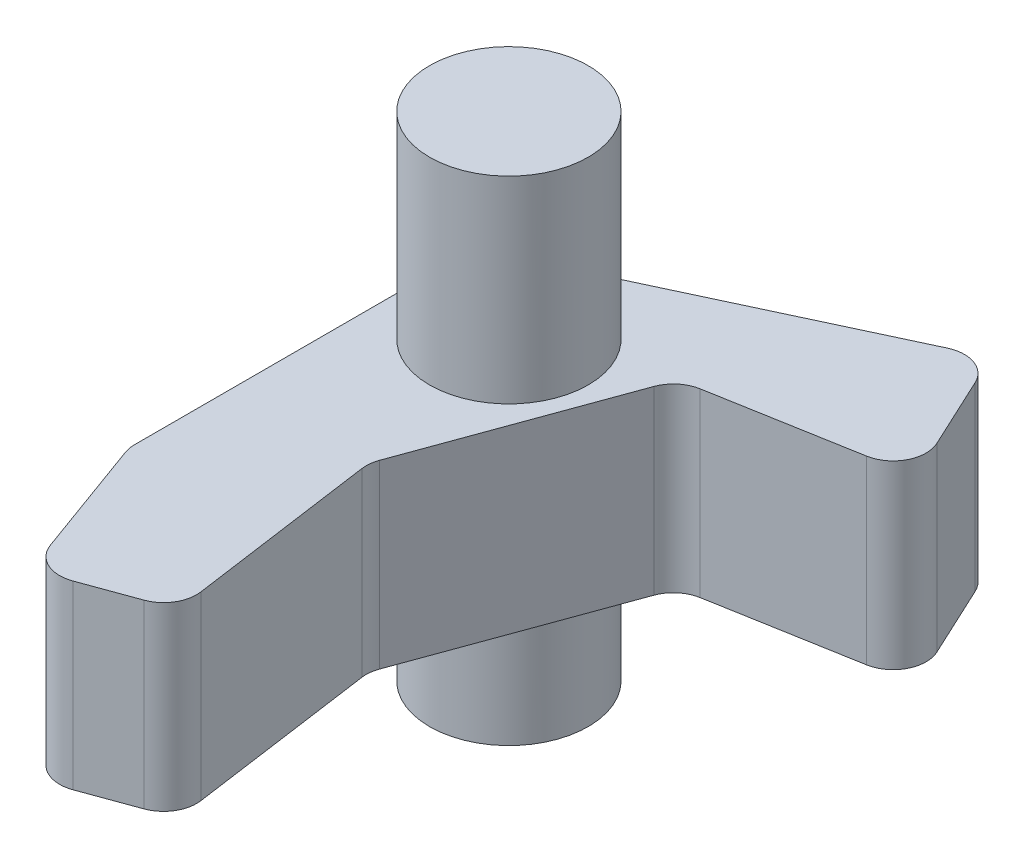
ISO-10303-21;
HEADER;
FILE_DESCRIPTION(('STEP AP214'),'2;1');
FILE_NAME('part.step','',(''),(''),'','','');
FILE_SCHEMA(('AUTOMOTIVE_DESIGN { 1 0 10303 214 1 1 1 1 }'));
ENDSEC;
DATA;
#1=APPLICATION_CONTEXT('core data for automotive mechanical design processes');
#2=APPLICATION_PROTOCOL_DEFINITION('international standard','automotive_design',2000,#1);
#3=PRODUCT_CONTEXT('',#1,'mechanical');
#4=PRODUCT('Part','Part','',(#3));
#5=PRODUCT_RELATED_PRODUCT_CATEGORY('part','',(#4));
#6=PRODUCT_DEFINITION_FORMATION('','',#4);
#7=PRODUCT_DEFINITION_CONTEXT('part definition',#1,'design');
#8=PRODUCT_DEFINITION('design','',#6,#7);
#9=PRODUCT_DEFINITION_SHAPE('','',#8);
#10=(LENGTH_UNIT() NAMED_UNIT(*) SI_UNIT(.MILLI.,.METRE.));
#11=(NAMED_UNIT(*) PLANE_ANGLE_UNIT() SI_UNIT($,.RADIAN.));
#12=(NAMED_UNIT(*) SI_UNIT($,.STERADIAN.) SOLID_ANGLE_UNIT());
#13=UNCERTAINTY_MEASURE_WITH_UNIT(LENGTH_MEASURE(1.E-05),#10,'distance_accuracy_value','');
#14=(GEOMETRIC_REPRESENTATION_CONTEXT(3) GLOBAL_UNCERTAINTY_ASSIGNED_CONTEXT((#13)) GLOBAL_UNIT_ASSIGNED_CONTEXT((#10,
#11,#12)) REPRESENTATION_CONTEXT('',''));
#15=CARTESIAN_POINT('',(0.,0.,0.));
#16=DIRECTION('',(0.,0.,1.));
#17=DIRECTION('',(1.,0.,0.));
#18=AXIS2_PLACEMENT_3D('',#15,#16,#17);
#19=CARTESIAN_POINT('',(0.,2.2,0.));
#20=DIRECTION('',(1.,0.,0.));
#21=DIRECTION('',(0.,0.,-1.));
#22=AXIS2_PLACEMENT_3D('',#19,#20,#21);
#23=PLANE('',#22);
#24=DIRECTION('',(0.,0.,1.));
#25=VECTOR('',#24,1.);
#26=CARTESIAN_POINT('',(0.,2.2,0.));
#27=LINE('',#26,#25);
#28=CARTESIAN_POINT('',(0.,2.2,0.764484312968994));
#29=VERTEX_POINT('',#28);
#30=CARTESIAN_POINT('',(0.,2.2,4.12946920771661));
#31=VERTEX_POINT('',#30);
#32=EDGE_CURVE('E187',#29,#31,#27,.T.);
#33=ORIENTED_EDGE('',*,*,#32,.F.);
#34=DIRECTION('',(0.,-1.,0.));
#35=VECTOR('',#34,1.);
#36=CARTESIAN_POINT('',(0.,2.2,0.764484312968994));
#37=LINE('',#36,#35);
#38=CARTESIAN_POINT('',(0.,0.,0.764484312968994));
#39=VERTEX_POINT('',#38);
#40=EDGE_CURVE('E251',#29,#39,#37,.T.);
#41=ORIENTED_EDGE('',*,*,#40,.T.);
#42=DIRECTION('',(0.,0.,1.));
#43=VECTOR('',#42,1.);
#44=CARTESIAN_POINT('',(0.,0.,0.));
#45=LINE('',#44,#43);
#46=CARTESIAN_POINT('',(0.,0.,4.12946920771661));
#47=VERTEX_POINT('',#46);
#48=EDGE_CURVE('E257',#39,#47,#45,.T.);
#49=ORIENTED_EDGE('',*,*,#48,.T.);
#50=DIRECTION('',(0.,-1.,0.));
#51=VECTOR('',#50,1.);
#52=CARTESIAN_POINT('',(0.,2.2,4.12946920771661));
#53=LINE('',#52,#51);
#54=EDGE_CURVE('E229',#47,#31,#53,.F.);
#55=ORIENTED_EDGE('',*,*,#54,.T.);
#56=EDGE_LOOP('',(#33,#41,#49,#55));
#57=FACE_BOUND('',#56,.T.);
#58=ADVANCED_FACE('F33',(#57),#23,.F.);
#59=CARTESIAN_POINT('',(0.,2.2,4.2));
#60=DIRECTION('',(0.939692620785908,0.,-0.34202014332567));
#61=DIRECTION('',(-0.34202014332567,0.,-0.939692620785908));
#62=AXIS2_PLACEMENT_3D('',#59,#60,#61);
#63=PLANE('',#62);
#64=DIRECTION('',(0.34202014332567,0.,0.939692620785908));
#65=VECTOR('',#64,1.);
#66=CARTESIAN_POINT('',(0.,0.,4.2));
#67=LINE('',#66,#65);
#68=CARTESIAN_POINT('',(0.0241229516856375,0.,4.26627726504688));
#69=VERTEX_POINT('',#68);
#70=CARTESIAN_POINT('',(0.547232229321074,0.,5.70350819325745));
#71=VERTEX_POINT('',#70);
#72=EDGE_CURVE('E179',#69,#71,#67,.T.);
#73=ORIENTED_EDGE('',*,*,#72,.T.);
#74=DIRECTION('',(0.,-1.,0.));
#75=VECTOR('',#74,1.);
#76=CARTESIAN_POINT('',(0.547232229321074,2.2,5.70350819325745));
#77=LINE('',#76,#75);
#78=CARTESIAN_POINT('',(0.547232229321074,2.2,5.70350819325745));
#79=VERTEX_POINT('',#78);
#80=EDGE_CURVE('E227',#71,#79,#77,.F.);
#81=ORIENTED_EDGE('',*,*,#80,.T.);
#82=DIRECTION('',(0.34202014332567,0.,0.939692620785908));
#83=VECTOR('',#82,1.);
#84=CARTESIAN_POINT('',(0.,2.2,4.2));
#85=LINE('',#84,#83);
#86=CARTESIAN_POINT('',(0.0241229516856375,2.2,4.26627726504688));
#87=VERTEX_POINT('',#86);
#88=EDGE_CURVE('E280',#87,#79,#85,.T.);
#89=ORIENTED_EDGE('',*,*,#88,.F.);
#90=DIRECTION('',(0.,-1.,0.));
#91=VECTOR('',#90,1.);
#92=CARTESIAN_POINT('',(0.0241229516856375,2.2,4.26627726504688));
#93=LINE('',#92,#91);
#94=EDGE_CURVE('E224',#87,#69,#93,.T.);
#95=ORIENTED_EDGE('',*,*,#94,.T.);
#96=EDGE_LOOP('',(#73,#81,#89,#95));
#97=FACE_BOUND('',#96,.T.);
#98=ADVANCED_FACE('F312',(#97),#63,.F.);
#99=CARTESIAN_POINT('',(2.56342552822316,2.2,5.39534495492048));
#100=DIRECTION('',(-0.342020143325667,0.,-0.939692620785909));
#101=DIRECTION('',(-0.939692620785909,0.,0.342020143325667));
#102=AXIS2_PLACEMENT_3D('',#99,#100,#101);
#103=PLANE('',#102);
#104=DIRECTION('',(0.939692620785909,0.,-0.342020143325667));
#105=VECTOR('',#104,1.);
#106=CARTESIAN_POINT('',(2.56342552822316,0.,5.39534495492048));
#107=LINE('',#106,#105);
#108=CARTESIAN_POINT('',(1.0599173349657,0.,5.94257718424155));
#109=VERTEX_POINT('',#108);
#110=CARTESIAN_POINT('',(1.69523072358215,0.,5.71134202135437));
#111=VERTEX_POINT('',#110);
#112=EDGE_CURVE('E173',#109,#111,#107,.T.);
#113=ORIENTED_EDGE('',*,*,#112,.T.);
#114=DIRECTION('',(0.,-1.,0.));
#115=VECTOR('',#114,1.);
#116=CARTESIAN_POINT('',(1.69523072358215,2.2,5.71134202135437));
#117=LINE('',#116,#115);
#118=CARTESIAN_POINT('',(1.69523072358215,2.2,5.71134202135437));
#119=VERTEX_POINT('',#118);
#120=EDGE_CURVE('E200',#111,#119,#117,.F.);
#121=ORIENTED_EDGE('',*,*,#120,.T.);
#122=DIRECTION('',(0.939692620785909,0.,-0.342020143325667));
#123=VECTOR('',#122,1.);
#124=CARTESIAN_POINT('',(2.56342552822316,2.2,5.39534495492048));
#125=LINE('',#124,#123);
#126=CARTESIAN_POINT('',(1.0599173349657,2.2,5.94257718424155));
#127=VERTEX_POINT('',#126);
#128=EDGE_CURVE('E277',#127,#119,#125,.T.);
#129=ORIENTED_EDGE('',*,*,#128,.F.);
#130=DIRECTION('',(0.,-1.,0.));
#131=VECTOR('',#130,1.);
#132=CARTESIAN_POINT('',(1.0599173349657,2.2,5.94257718424155));
#133=LINE('',#132,#131);
#134=EDGE_CURVE('E197',#127,#109,#133,.T.);
#135=ORIENTED_EDGE('',*,*,#134,.T.);
#136=EDGE_LOOP('',(#113,#121,#129,#135));
#137=FACE_BOUND('',#136,.T.);
#138=ADVANCED_FACE('F317',(#137),#103,.F.);
#139=CARTESIAN_POINT('',(2.62404501571599,2.2,0.142040196925293));
#140=DIRECTION('',(-0.93969262078591,0.,-0.342020143325664));
#141=DIRECTION('',(-0.342020143325664,0.,0.93969262078591));
#142=AXIS2_PLACEMENT_3D('',#139,#140,#141);
#143=PLANE('',#142);
#144=DIRECTION('',(0.342020143325664,0.,-0.93969262078591));
#145=VECTOR('',#144,1.);
#146=CARTESIAN_POINT('',(2.62404501571599,2.2,0.142040196925293));
#147=LINE('',#146,#145);
#148=CARTESIAN_POINT('',(1.65422559911628,2.2,2.80659714498169));
#149=VERTEX_POINT('',#148);
#150=CARTESIAN_POINT('',(2.54505884698906,2.2,0.359052911951794));
#151=VERTEX_POINT('',#150);
#152=EDGE_CURVE('E165',#149,#151,#147,.T.);
#153=ORIENTED_EDGE('',*,*,#152,.F.);
#154=DIRECTION('',(0.,1.,0.));
#155=VECTOR('',#154,1.);
#156=CARTESIAN_POINT('',(1.65422559911628,2.2,2.80659714498169));
#157=LINE('',#156,#155);
#158=CARTESIAN_POINT('',(1.65422559911628,0.,2.80659714498169));
#159=VERTEX_POINT('',#158);
#160=EDGE_CURVE('E150',#149,#159,#157,.F.);
#161=ORIENTED_EDGE('',*,*,#160,.T.);
#162=DIRECTION('',(0.342020143325664,0.,-0.93969262078591));
#163=VECTOR('',#162,1.);
#164=CARTESIAN_POINT('',(2.62404501571599,0.,0.142040196925293));
#165=LINE('',#164,#163);
#166=CARTESIAN_POINT('',(2.54505884698906,0.,0.359052911951794));
#167=VERTEX_POINT('',#166);
#168=EDGE_CURVE('E162',#159,#167,#165,.T.);
#169=ORIENTED_EDGE('',*,*,#168,.T.);
#170=DIRECTION('',(0.,-1.,0.));
#171=VECTOR('',#170,1.);
#172=CARTESIAN_POINT('',(2.54505884698906,2.2,0.359052911951794));
#173=LINE('',#172,#171);
#174=EDGE_CURVE('E167',#167,#151,#173,.F.);
#175=ORIENTED_EDGE('',*,*,#174,.T.);
#176=EDGE_LOOP('',(#153,#161,#169,#175));
#177=FACE_BOUND('',#176,.T.);
#178=ADVANCED_FACE('F161',(#177),#143,.F.);
#179=CARTESIAN_POINT('',(5.08606439824651,2.2,-0.292080247242038));
#180=DIRECTION('',(-0.173648177666932,0.,-0.984807753012208));
#181=DIRECTION('',(-0.984807753012208,0.,0.173648177666932));
#182=AXIS2_PLACEMENT_3D('',#179,#180,#181);
#183=PLANE('',#182);
#184=DIRECTION('',(0.984807753012208,0.,-0.173648177666932));
#185=VECTOR('',#184,1.);
#186=CARTESIAN_POINT('',(5.08606439824651,2.2,-0.292080247242038));
#187=LINE('',#186,#185);
#188=CARTESIAN_POINT('',(2.85147662423665,2.2,0.101937868077177));
#189=VERTEX_POINT('',#188);
#190=CARTESIAN_POINT('',(4.57269381780802,2.2,-0.201559162808765));
#191=VERTEX_POINT('',#190);
#192=EDGE_CURVE('E273',#189,#191,#187,.T.);
#193=ORIENTED_EDGE('',*,*,#192,.F.);
#194=DIRECTION('',(0.,-1.,0.));
#195=VECTOR('',#194,1.);
#196=CARTESIAN_POINT('',(2.85147662423665,0.,0.101937868077177));
#197=LINE('',#196,#195);
#198=CARTESIAN_POINT('',(2.85147662423665,0.,0.101937868077177));
#199=VERTEX_POINT('',#198);
#200=EDGE_CURVE('E234',#189,#199,#197,.T.);
#201=ORIENTED_EDGE('',*,*,#200,.T.);
#202=DIRECTION('',(0.984807753012208,0.,-0.173648177666932));
#203=VECTOR('',#202,1.);
#204=CARTESIAN_POINT('',(5.08606439824651,0.,-0.292080247242038));
#205=LINE('',#204,#203);
#206=CARTESIAN_POINT('',(4.57269381780802,0.,-0.201559162808765));
#207=VERTEX_POINT('',#206);
#208=EDGE_CURVE('E172',#199,#207,#205,.T.);
#209=ORIENTED_EDGE('',*,*,#208,.T.);
#210=DIRECTION('',(0.,-1.,0.));
#211=VECTOR('',#210,1.);
#212=CARTESIAN_POINT('',(4.57269381780802,2.2,-0.201559162808765));
#213=LINE('',#212,#211);
#214=EDGE_CURVE('E232',#207,#191,#213,.F.);
#215=ORIENTED_EDGE('',*,*,#214,.T.);
#216=EDGE_LOOP('',(#193,#201,#209,#215));
#217=FACE_BOUND('',#216,.T.);
#218=ADVANCED_FACE('F366',(#217),#183,.F.);
#219=CARTESIAN_POINT('',(5.08606439824651,2.2,-0.292080247242038));
#220=DIRECTION('',(-0.906307787036652,0.,0.422618261740694));
#221=DIRECTION('',(0.422618261740694,0.,0.906307787036652));
#222=AXIS2_PLACEMENT_3D('',#219,#220,#221);
#223=PLANE('',#222);
#224=DIRECTION('',(-0.422618261740694,0.,-0.906307787036652));
#225=VECTOR('',#224,1.);
#226=CARTESIAN_POINT('',(5.08606439824651,2.2,-0.292080247242038));
#227=LINE('',#226,#225);
#228=CARTESIAN_POINT('',(4.86575766155591,2.2,-0.764529568709926));
#229=VERTEX_POINT('',#228);
#230=CARTESIAN_POINT('',(4.45858231762218,2.2,-1.63771991163668));
#231=VERTEX_POINT('',#230);
#232=EDGE_CURVE('E270',#229,#231,#227,.T.);
#233=ORIENTED_EDGE('',*,*,#232,.F.);
#234=DIRECTION('',(0.,-1.,0.));
#235=VECTOR('',#234,1.);
#236=CARTESIAN_POINT('',(4.86575766155591,2.2,-0.764529568709926));
#237=LINE('',#236,#235);
#238=CARTESIAN_POINT('',(4.86575766155591,0.,-0.764529568709926));
#239=VERTEX_POINT('',#238);
#240=EDGE_CURVE('E239',#229,#239,#237,.T.);
#241=ORIENTED_EDGE('',*,*,#240,.T.);
#242=DIRECTION('',(-0.422618261740694,0.,-0.906307787036652));
#243=VECTOR('',#242,1.);
#244=CARTESIAN_POINT('',(5.08606439824651,0.,-0.292080247242038));
#245=LINE('',#244,#243);
#246=CARTESIAN_POINT('',(4.45858231762218,0.,-1.63771991163668));
#247=VERTEX_POINT('',#246);
#248=EDGE_CURVE('E176',#239,#247,#245,.T.);
#249=ORIENTED_EDGE('',*,*,#248,.T.);
#250=DIRECTION('',(0.,-1.,0.));
#251=VECTOR('',#250,1.);
#252=CARTESIAN_POINT('',(4.45858231762218,2.2,-1.63771991163668));
#253=LINE('',#252,#251);
#254=EDGE_CURVE('E237',#247,#231,#253,.F.);
#255=ORIENTED_EDGE('',*,*,#254,.T.);
#256=EDGE_LOOP('',(#233,#241,#249,#255));
#257=FACE_BOUND('',#256,.T.);
#258=ADVANCED_FACE('F360',(#257),#223,.F.);
#259=CARTESIAN_POINT('',(4.2895350129259,2.2,-2.00024302645134));
#260=DIRECTION('',(0.422618261740697,0.,0.906307787036651));
#261=DIRECTION('',(0.906307787036651,0.,-0.422618261740697));
#262=AXIS2_PLACEMENT_3D('',#259,#260,#261);
#263=PLANE('',#262);
#264=DIRECTION('',(-0.906307787036651,0.,0.422618261740697));
#265=VECTOR('',#264,1.);
#266=CARTESIAN_POINT('',(4.2895350129259,0.,-2.00024302645134));
#267=LINE('',#266,#265);
#268=CARTESIAN_POINT('',(3.92701189811124,0.,-1.83119572175506));
#269=VERTEX_POINT('',#268);
#270=CARTESIAN_POINT('',(0.692858085911164,0.,-0.323085031474988));
#271=VERTEX_POINT('',#270);
#272=EDGE_CURVE('E185',#269,#271,#267,.T.);
#273=ORIENTED_EDGE('',*,*,#272,.T.);
#274=DIRECTION('',(0.,-1.,0.));
#275=VECTOR('',#274,1.);
#276=CARTESIAN_POINT('',(0.692858085911162,2.2,-0.323085031474987));
#277=LINE('',#276,#275);
#278=CARTESIAN_POINT('',(0.692858085911164,2.2,-0.323085031474988));
#279=VERTEX_POINT('',#278);
#280=EDGE_CURVE('E41',#271,#279,#277,.F.);
#281=ORIENTED_EDGE('',*,*,#280,.T.);
#282=DIRECTION('',(-0.906307787036651,0.,0.422618261740697));
#283=VECTOR('',#282,1.);
#284=CARTESIAN_POINT('',(4.2895350129259,2.2,-2.00024302645134));
#285=LINE('',#284,#283);
#286=CARTESIAN_POINT('',(3.92701189811124,2.2,-1.83119572175506));
#287=VERTEX_POINT('',#286);
#288=EDGE_CURVE('E191',#287,#279,#285,.T.);
#289=ORIENTED_EDGE('',*,*,#288,.F.);
#290=DIRECTION('',(0.,-1.,0.));
#291=VECTOR('',#290,1.);
#292=CARTESIAN_POINT('',(3.92701189811124,2.2,-1.83119572175506));
#293=LINE('',#292,#291);
#294=EDGE_CURVE('E156',#287,#269,#293,.T.);
#295=ORIENTED_EDGE('',*,*,#294,.T.);
#296=EDGE_LOOP('',(#273,#281,#289,#295));
#297=FACE_BOUND('',#296,.T.);
#298=ADVANCED_FACE('F302',(#297),#263,.F.);
#299=CARTESIAN_POINT('',(0.,2.2,0.));
#300=DIRECTION('',(0.,-1.,0.));
#301=DIRECTION('',(0.,0.,-1.));
#302=AXIS2_PLACEMENT_3D('',#299,#300,#301);
#303=PLANE('',#302);
#304=CARTESIAN_POINT('',(1.1653668868688,2.2,0.742420586553926));
#305=DIRECTION('',(0.,-1.,0.));
#306=DIRECTION('',(0.,0.,-1.));
#307=AXIS2_PLACEMENT_3D('',#304,#305,#306);
#308=CIRCLE('',#307,0.965366886868802);
#309=CARTESIAN_POINT('',(1.1653668868688,2.2,-0.222946300314876));
#310=VERTEX_POINT('',#309);
#311=EDGE_CURVE('E262',#310,#310,#308,.T.);
#312=ORIENTED_EDGE('',*,*,#311,.T.);
#313=EDGE_LOOP('',(#312));
#314=FACE_BOUND('',#313,.T.);
#315=ORIENTED_EDGE('',*,*,#288,.T.);
#316=CARTESIAN_POINT('',(1.2,2.2,0.764484312968993));
#317=DIRECTION('',(0.,-1.,0.));
#318=DIRECTION('',(0.,0.,-1.));
#319=AXIS2_PLACEMENT_3D('',#316,#317,#318);
#320=CIRCLE('',#319,1.2);
#321=EDGE_CURVE('E11',#279,#29,#320,.F.);
#322=ORIENTED_EDGE('',*,*,#321,.T.);
#323=ORIENTED_EDGE('',*,*,#32,.T.);
#324=CARTESIAN_POINT('',(0.400000000000001,2.2,4.12946920771661));
#325=DIRECTION('',(0.,-1.,0.));
#326=DIRECTION('',(0.,0.,-1.));
#327=AXIS2_PLACEMENT_3D('',#324,#325,#326);
#328=CIRCLE('',#327,0.4);
#329=EDGE_CURVE('E207',#31,#87,#328,.F.);
#330=ORIENTED_EDGE('',*,*,#329,.T.);
#331=ORIENTED_EDGE('',*,*,#88,.T.);
#332=CARTESIAN_POINT('',(0.923109277635437,2.2,5.56670013592719));
#333=DIRECTION('',(0.,-1.,0.));
#334=DIRECTION('',(0.,0.,-1.));
#335=AXIS2_PLACEMENT_3D('',#332,#333,#334);
#336=CIRCLE('',#335,0.4);
#337=EDGE_CURVE('E209',#79,#127,#336,.F.);
#338=ORIENTED_EDGE('',*,*,#337,.T.);
#339=ORIENTED_EDGE('',*,*,#128,.T.);
#340=CARTESIAN_POINT('',(1.55842266625189,2.2,5.33546497304));
#341=DIRECTION('',(0.,-1.,0.));
#342=DIRECTION('',(0.,0.,-1.));
#343=AXIS2_PLACEMENT_3D('',#340,#341,#342);
#344=CIRCLE('',#343,0.4);
#345=CARTESIAN_POINT('',(1.95452989374852,2.2,5.27979573265598));
#346=VERTEX_POINT('',#345);
#347=EDGE_CURVE('E211',#119,#346,#344,.F.);
#348=ORIENTED_EDGE('',*,*,#347,.T.);
#349=DIRECTION('',(0.139173100960067,0.,0.99026806874157));
#350=VECTOR('',#349,1.);
#351=CARTESIAN_POINT('',(1.59797856962028,2.2,2.74280123647793));
#352=LINE('',#351,#350);
#353=CARTESIAN_POINT('',(1.63399541993402,2.2,2.99907444269599));
#354=VERTEX_POINT('',#353);
#355=EDGE_CURVE('E190',#346,#354,#352,.F.);
#356=ORIENTED_EDGE('',*,*,#355,.T.);
#357=CARTESIAN_POINT('',(2.03010264743065,2.2,2.94340520231196));
#358=DIRECTION('',(0.,-1.,0.));
#359=DIRECTION('',(0.,0.,-1.));
#360=AXIS2_PLACEMENT_3D('',#357,#358,#359);
#361=CIRCLE('',#360,0.4);
#362=EDGE_CURVE('E155',#354,#149,#361,.T.);
#363=ORIENTED_EDGE('',*,*,#362,.T.);
#364=ORIENTED_EDGE('',*,*,#152,.T.);
#365=CARTESIAN_POINT('',(2.92093589530342,2.2,0.49586096928206));
#366=DIRECTION('',(0.,-1.,0.));
#367=DIRECTION('',(0.,0.,-1.));
#368=AXIS2_PLACEMENT_3D('',#365,#366,#367);
#369=CIRCLE('',#368,0.4);
#370=EDGE_CURVE('E246',#151,#189,#369,.T.);
#371=ORIENTED_EDGE('',*,*,#370,.T.);
#372=ORIENTED_EDGE('',*,*,#192,.T.);
#373=CARTESIAN_POINT('',(4.50323454674125,2.2,-0.595482264013648));
#374=DIRECTION('',(0.,-1.,0.));
#375=DIRECTION('',(0.,0.,-1.));
#376=AXIS2_PLACEMENT_3D('',#373,#374,#375);
#377=CIRCLE('',#376,0.4);
#378=EDGE_CURVE('E205',#191,#229,#377,.F.);
#379=ORIENTED_EDGE('',*,*,#378,.T.);
#380=ORIENTED_EDGE('',*,*,#232,.T.);
#381=CARTESIAN_POINT('',(4.09605920280752,2.2,-1.4686726069404));
#382=DIRECTION('',(0.,-1.,0.));
#383=DIRECTION('',(0.,0.,-1.));
#384=AXIS2_PLACEMENT_3D('',#381,#382,#383);
#385=CIRCLE('',#384,0.4);
#386=EDGE_CURVE('E203',#231,#287,#385,.F.);
#387=ORIENTED_EDGE('',*,*,#386,.T.);
#388=EDGE_LOOP('',(#315,#322,#323,#330,#331,#338,#339,#348,#356,#363,#364,#371,#372,#379,#380,#387));
#389=FACE_BOUND('',#388,.T.);
#390=ADVANCED_FACE('F299',(#314,#389),#303,.F.);
#391=CARTESIAN_POINT('',(0.,0.,0.));
#392=DIRECTION('',(0.,-1.,0.));
#393=DIRECTION('',(0.,0.,-1.));
#394=AXIS2_PLACEMENT_3D('',#391,#392,#393);
#395=PLANE('',#394);
#396=CARTESIAN_POINT('',(1.1653668868688,0.,0.742420586553926));
#397=DIRECTION('',(0.,-1.,0.));
#398=DIRECTION('',(0.,0.,-1.));
#399=AXIS2_PLACEMENT_3D('',#396,#397,#398);
#400=CIRCLE('',#399,0.965366886868802);
#401=CARTESIAN_POINT('',(1.1653668868688,0.,-0.222946300314876));
#402=VERTEX_POINT('',#401);
#403=EDGE_CURVE('E248',#402,#402,#400,.T.);
#404=ORIENTED_EDGE('',*,*,#403,.F.);
#405=EDGE_LOOP('',(#404));
#406=FACE_BOUND('',#405,.T.);
#407=ORIENTED_EDGE('',*,*,#48,.F.);
#408=CARTESIAN_POINT('',(1.2,0.,0.764484312968993));
#409=DIRECTION('',(0.,-1.,0.));
#410=DIRECTION('',(0.,0.,-1.));
#411=AXIS2_PLACEMENT_3D('',#408,#409,#410);
#412=CIRCLE('',#411,1.2);
#413=EDGE_CURVE('E55',#39,#271,#412,.T.);
#414=ORIENTED_EDGE('',*,*,#413,.T.);
#415=ORIENTED_EDGE('',*,*,#272,.F.);
#416=CARTESIAN_POINT('',(4.09605920280752,0.,-1.4686726069404));
#417=DIRECTION('',(0.,-1.,0.));
#418=DIRECTION('',(0.,0.,-1.));
#419=AXIS2_PLACEMENT_3D('',#416,#417,#418);
#420=CIRCLE('',#419,0.4);
#421=EDGE_CURVE('E213',#269,#247,#420,.T.);
#422=ORIENTED_EDGE('',*,*,#421,.T.);
#423=ORIENTED_EDGE('',*,*,#248,.F.);
#424=CARTESIAN_POINT('',(4.50323454674125,0.,-0.595482264013648));
#425=DIRECTION('',(0.,-1.,0.));
#426=DIRECTION('',(0.,0.,-1.));
#427=AXIS2_PLACEMENT_3D('',#424,#425,#426);
#428=CIRCLE('',#427,0.4);
#429=EDGE_CURVE('E215',#239,#207,#428,.T.);
#430=ORIENTED_EDGE('',*,*,#429,.T.);
#431=ORIENTED_EDGE('',*,*,#208,.F.);
#432=CARTESIAN_POINT('',(2.92093589530342,0.,0.49586096928206));
#433=DIRECTION('',(0.,-1.,0.));
#434=DIRECTION('',(0.,0.,-1.));
#435=AXIS2_PLACEMENT_3D('',#432,#433,#434);
#436=CIRCLE('',#435,0.4);
#437=EDGE_CURVE('E171',#199,#167,#436,.F.);
#438=ORIENTED_EDGE('',*,*,#437,.T.);
#439=ORIENTED_EDGE('',*,*,#168,.F.);
#440=CARTESIAN_POINT('',(2.03010264743065,0.,2.94340520231196));
#441=DIRECTION('',(0.,-1.,0.));
#442=DIRECTION('',(0.,0.,-1.));
#443=AXIS2_PLACEMENT_3D('',#440,#441,#442);
#444=CIRCLE('',#443,0.4);
#445=CARTESIAN_POINT('',(1.63399541993402,0.,2.99907444269599));
#446=VERTEX_POINT('',#445);
#447=EDGE_CURVE('E146',#159,#446,#444,.F.);
#448=ORIENTED_EDGE('',*,*,#447,.T.);
#449=DIRECTION('',(-0.139173100960067,0.,-0.99026806874157));
#450=VECTOR('',#449,1.);
#451=CARTESIAN_POINT('',(1.18901783958608,0.,-0.167105559651464));
#452=LINE('',#451,#450);
#453=CARTESIAN_POINT('',(1.95452989374852,0.,5.27979573265598));
#454=VERTEX_POINT('',#453);
#455=EDGE_CURVE('E188',#446,#454,#452,.F.);
#456=ORIENTED_EDGE('',*,*,#455,.T.);
#457=CARTESIAN_POINT('',(1.55842266625189,0.,5.33546497304));
#458=DIRECTION('',(0.,-1.,0.));
#459=DIRECTION('',(0.,0.,-1.));
#460=AXIS2_PLACEMENT_3D('',#457,#458,#459);
#461=CIRCLE('',#460,0.4);
#462=EDGE_CURVE('E222',#454,#111,#461,.T.);
#463=ORIENTED_EDGE('',*,*,#462,.T.);
#464=ORIENTED_EDGE('',*,*,#112,.F.);
#465=CARTESIAN_POINT('',(0.923109277635437,0.,5.56670013592719));
#466=DIRECTION('',(0.,-1.,0.));
#467=DIRECTION('',(0.,0.,-1.));
#468=AXIS2_PLACEMENT_3D('',#465,#466,#467);
#469=CIRCLE('',#468,0.4);
#470=EDGE_CURVE('E220',#109,#71,#469,.T.);
#471=ORIENTED_EDGE('',*,*,#470,.T.);
#472=ORIENTED_EDGE('',*,*,#72,.F.);
#473=CARTESIAN_POINT('',(0.400000000000001,0.,4.12946920771661));
#474=DIRECTION('',(0.,-1.,0.));
#475=DIRECTION('',(0.,0.,-1.));
#476=AXIS2_PLACEMENT_3D('',#473,#474,#475);
#477=CIRCLE('',#476,0.4);
#478=EDGE_CURVE('E217',#69,#47,#477,.T.);
#479=ORIENTED_EDGE('',*,*,#478,.T.);
#480=EDGE_LOOP('',(#407,#414,#415,#422,#423,#430,#431,#438,#439,#448,#456,#463,#464,#471,#472,#479));
#481=FACE_BOUND('',#480,.T.);
#482=ADVANCED_FACE('F169',(#406,#481),#395,.T.);
#483=CARTESIAN_POINT('',(1.59797856962028,2.2,2.74280123647793));
#484=DIRECTION('',(-0.99026806874157,0.,0.139173100960067));
#485=DIRECTION('',(0.,-1.,0.));
#486=AXIS2_PLACEMENT_3D('',#483,#484,#485);
#487=PLANE('',#486);
#488=ORIENTED_EDGE('',*,*,#455,.F.);
#489=DIRECTION('',(0.,-1.,0.));
#490=VECTOR('',#489,1.);
#491=CARTESIAN_POINT('',(1.63399541993402,2.2,2.99907444269599));
#492=LINE('',#491,#490);
#493=EDGE_CURVE('E151',#446,#354,#492,.F.);
#494=ORIENTED_EDGE('',*,*,#493,.T.);
#495=ORIENTED_EDGE('',*,*,#355,.F.);
#496=DIRECTION('',(0.,1.,0.));
#497=VECTOR('',#496,1.);
#498=CARTESIAN_POINT('',(1.95452989374852,0.,5.27979573265598));
#499=LINE('',#498,#497);
#500=EDGE_CURVE('E166',#346,#454,#499,.F.);
#501=ORIENTED_EDGE('',*,*,#500,.T.);
#502=EDGE_LOOP('',(#488,#494,#495,#501));
#503=FACE_BOUND('',#502,.T.);
#504=ADVANCED_FACE('F322',(#503),#487,.F.);
#505=CARTESIAN_POINT('',(2.03010264743065,2.2,2.94340520231196));
#506=DIRECTION('',(0.,1.,0.));
#507=DIRECTION('',(0.,0.,1.));
#508=AXIS2_PLACEMENT_3D('',#505,#506,#507);
#509=CYLINDRICAL_SURFACE('',#508,0.4);
#510=ORIENTED_EDGE('',*,*,#362,.F.);
#511=ORIENTED_EDGE('',*,*,#493,.F.);
#512=ORIENTED_EDGE('',*,*,#447,.F.);
#513=ORIENTED_EDGE('',*,*,#160,.F.);
#514=EDGE_LOOP('',(#510,#511,#512,#513));
#515=FACE_BOUND('',#514,.T.);
#516=ADVANCED_FACE('F149',(#515),#509,.F.);
#517=CARTESIAN_POINT('',(1.55842266625189,2.2,5.33546497304));
#518=DIRECTION('',(0.,1.,0.));
#519=DIRECTION('',(0.,0.,1.));
#520=AXIS2_PLACEMENT_3D('',#517,#518,#519);
#521=CYLINDRICAL_SURFACE('',#520,0.4);
#522=ORIENTED_EDGE('',*,*,#462,.F.);
#523=ORIENTED_EDGE('',*,*,#500,.F.);
#524=ORIENTED_EDGE('',*,*,#347,.F.);
#525=ORIENTED_EDGE('',*,*,#120,.F.);
#526=EDGE_LOOP('',(#522,#523,#524,#525));
#527=FACE_BOUND('',#526,.T.);
#528=ADVANCED_FACE('F328',(#527),#521,.T.);
#529=CARTESIAN_POINT('',(0.923109277635437,2.2,5.56670013592719));
#530=DIRECTION('',(0.,-1.,0.));
#531=DIRECTION('',(0.,0.,-1.));
#532=AXIS2_PLACEMENT_3D('',#529,#530,#531);
#533=CYLINDRICAL_SURFACE('',#532,0.4);
#534=ORIENTED_EDGE('',*,*,#337,.F.);
#535=ORIENTED_EDGE('',*,*,#80,.F.);
#536=ORIENTED_EDGE('',*,*,#470,.F.);
#537=ORIENTED_EDGE('',*,*,#134,.F.);
#538=EDGE_LOOP('',(#534,#535,#536,#537));
#539=FACE_BOUND('',#538,.T.);
#540=ADVANCED_FACE('F331',(#539),#533,.T.);
#541=CARTESIAN_POINT('',(0.400000000000001,2.2,4.12946920771661));
#542=DIRECTION('',(0.,-1.,0.));
#543=DIRECTION('',(0.,0.,-1.));
#544=AXIS2_PLACEMENT_3D('',#541,#542,#543);
#545=CYLINDRICAL_SURFACE('',#544,0.4);
#546=ORIENTED_EDGE('',*,*,#329,.F.);
#547=ORIENTED_EDGE('',*,*,#54,.F.);
#548=ORIENTED_EDGE('',*,*,#478,.F.);
#549=ORIENTED_EDGE('',*,*,#94,.F.);
#550=EDGE_LOOP('',(#546,#547,#548,#549));
#551=FACE_BOUND('',#550,.T.);
#552=ADVANCED_FACE('F335',(#551),#545,.T.);
#553=CARTESIAN_POINT('',(2.92093589530342,2.2,0.49586096928206));
#554=DIRECTION('',(0.,1.,0.));
#555=DIRECTION('',(0.,0.,1.));
#556=AXIS2_PLACEMENT_3D('',#553,#554,#555);
#557=CYLINDRICAL_SURFACE('',#556,0.4);
#558=ORIENTED_EDGE('',*,*,#370,.F.);
#559=ORIENTED_EDGE('',*,*,#174,.F.);
#560=ORIENTED_EDGE('',*,*,#437,.F.);
#561=ORIENTED_EDGE('',*,*,#200,.F.);
#562=EDGE_LOOP('',(#558,#559,#560,#561));
#563=FACE_BOUND('',#562,.T.);
#564=ADVANCED_FACE('F339',(#563),#557,.F.);
#565=CARTESIAN_POINT('',(4.50323454674125,2.2,-0.595482264013648));
#566=DIRECTION('',(0.,-1.,0.));
#567=DIRECTION('',(0.,0.,-1.));
#568=AXIS2_PLACEMENT_3D('',#565,#566,#567);
#569=CYLINDRICAL_SURFACE('',#568,0.4);
#570=ORIENTED_EDGE('',*,*,#378,.F.);
#571=ORIENTED_EDGE('',*,*,#214,.F.);
#572=ORIENTED_EDGE('',*,*,#429,.F.);
#573=ORIENTED_EDGE('',*,*,#240,.F.);
#574=EDGE_LOOP('',(#570,#571,#572,#573));
#575=FACE_BOUND('',#574,.T.);
#576=ADVANCED_FACE('F343',(#575),#569,.T.);
#577=CARTESIAN_POINT('',(4.09605920280752,2.2,-1.4686726069404));
#578=DIRECTION('',(0.,-1.,0.));
#579=DIRECTION('',(0.,0.,-1.));
#580=AXIS2_PLACEMENT_3D('',#577,#578,#579);
#581=CYLINDRICAL_SURFACE('',#580,0.4);
#582=ORIENTED_EDGE('',*,*,#386,.F.);
#583=ORIENTED_EDGE('',*,*,#254,.F.);
#584=ORIENTED_EDGE('',*,*,#421,.F.);
#585=ORIENTED_EDGE('',*,*,#294,.F.);
#586=EDGE_LOOP('',(#582,#583,#584,#585));
#587=FACE_BOUND('',#586,.T.);
#588=ADVANCED_FACE('F346',(#587),#581,.T.);
#589=CARTESIAN_POINT('',(1.1653668868688,-1.4,0.742420586553926));
#590=DIRECTION('',(0.,1.,0.));
#591=DIRECTION('',(0.,0.,1.));
#592=AXIS2_PLACEMENT_3D('',#589,#590,#591);
#593=PLANE('',#592);
#594=CARTESIAN_POINT('',(1.1653668868688,-1.4,0.742420586553926));
#595=DIRECTION('',(0.,1.,0.));
#596=DIRECTION('',(0.,0.,1.));
#597=AXIS2_PLACEMENT_3D('',#594,#595,#596);
#598=CIRCLE('',#597,0.965366886868802);
#599=CARTESIAN_POINT('',(1.1653668868688,-1.4,1.70778747342273));
#600=VERTEX_POINT('',#599);
#601=EDGE_CURVE('E266',#600,#600,#598,.T.);
#602=ORIENTED_EDGE('',*,*,#601,.F.);
#603=EDGE_LOOP('',(#602));
#604=FACE_BOUND('',#603,.T.);
#605=ADVANCED_FACE('F349',(#604),#593,.F.);
#606=CARTESIAN_POINT('',(1.1653668868688,-1.4,0.742420586553926));
#607=DIRECTION('',(0.,1.,0.));
#608=DIRECTION('',(0.,0.,1.));
#609=AXIS2_PLACEMENT_3D('',#606,#607,#608);
#610=CYLINDRICAL_SURFACE('',#609,0.965366886868802);
#611=ORIENTED_EDGE('',*,*,#403,.T.);
#612=EDGE_LOOP('',(#611));
#613=FACE_BOUND('',#612,.T.);
#614=ORIENTED_EDGE('',*,*,#601,.T.);
#615=EDGE_LOOP('',(#614));
#616=FACE_BOUND('',#615,.T.);
#617=ADVANCED_FACE('F295',(#613,#616),#610,.T.);
#618=CARTESIAN_POINT('',(1.1653668868688,4.6,0.742420586553926));
#619=DIRECTION('',(0.,1.,0.));
#620=DIRECTION('',(0.,0.,1.));
#621=AXIS2_PLACEMENT_3D('',#618,#619,#620);
#622=CIRCLE('',#621,0.965366886868802);
#623=CARTESIAN_POINT('',(1.1653668868688,4.6,1.70778747342273));
#624=VERTEX_POINT('',#623);
#625=EDGE_CURVE('E286',#624,#624,#622,.T.);
#626=ORIENTED_EDGE('',*,*,#625,.F.);
#627=EDGE_LOOP('',(#626));
#628=FACE_BOUND('',#627,.T.);
#629=ORIENTED_EDGE('',*,*,#311,.F.);
#630=EDGE_LOOP('',(#629));
#631=FACE_BOUND('',#630,.T.);
#632=ADVANCED_FACE('F292',(#628,#631),#610,.T.);
#633=CARTESIAN_POINT('',(1.1653668868688,4.6,0.742420586553926));
#634=DIRECTION('',(0.,1.,0.));
#635=DIRECTION('',(0.,0.,1.));
#636=AXIS2_PLACEMENT_3D('',#633,#634,#635);
#637=PLANE('',#636);
#638=ORIENTED_EDGE('',*,*,#625,.T.);
#639=EDGE_LOOP('',(#638));
#640=FACE_BOUND('',#639,.T.);
#641=ADVANCED_FACE('F290',(#640),#637,.T.);
#642=CARTESIAN_POINT('',(1.2,2.2,0.764484312968993));
#643=DIRECTION('',(0.,-1.,0.));
#644=DIRECTION('',(0.,0.,-1.));
#645=AXIS2_PLACEMENT_3D('',#642,#643,#644);
#646=CYLINDRICAL_SURFACE('',#645,1.2);
#647=ORIENTED_EDGE('',*,*,#321,.F.);
#648=ORIENTED_EDGE('',*,*,#280,.F.);
#649=ORIENTED_EDGE('',*,*,#413,.F.);
#650=ORIENTED_EDGE('',*,*,#40,.F.);
#651=EDGE_LOOP('',(#647,#648,#649,#650));
#652=FACE_BOUND('',#651,.T.);
#653=ADVANCED_FACE('F35',(#652),#646,.T.);
#654=CLOSED_SHELL('',(#58,#98,#138,#178,#218,#258,#298,#390,#482,#504,#516,#528,#540,#552,#564,
#576,#588,#605,#617,#632,#641,#653));
#655=MANIFOLD_SOLID_BREP('B2',#654);
#656=ADVANCED_BREP_SHAPE_REPRESENTATION('',(#18,#655),#14);
#657=SHAPE_DEFINITION_REPRESENTATION(#9,#656);
ENDSEC;
END-ISO-10303-21;
